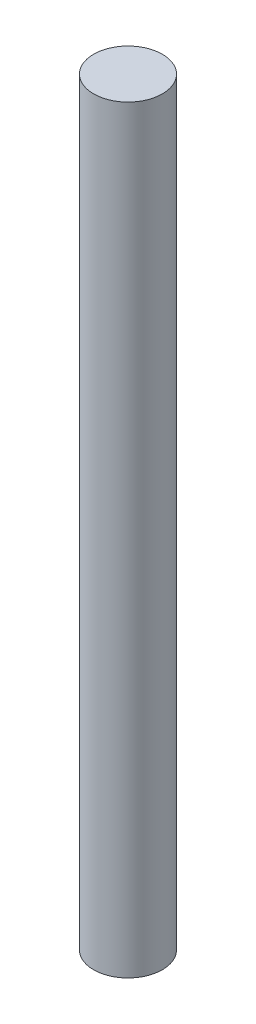
ISO-10303-21;
HEADER;
FILE_DESCRIPTION(('STEP AP214'),'2;1');
FILE_NAME('part.step','',(''),(''),'','','');
FILE_SCHEMA(('AUTOMOTIVE_DESIGN { 1 0 10303 214 1 1 1 1 }'));
ENDSEC;
DATA;
#1=APPLICATION_CONTEXT('core data for automotive mechanical design processes');
#2=APPLICATION_PROTOCOL_DEFINITION('international standard','automotive_design',2000,#1);
#3=PRODUCT_CONTEXT('',#1,'mechanical');
#4=PRODUCT('Part','Part','',(#3));
#5=PRODUCT_RELATED_PRODUCT_CATEGORY('part','',(#4));
#6=PRODUCT_DEFINITION_FORMATION('','',#4);
#7=PRODUCT_DEFINITION_CONTEXT('part definition',#1,'design');
#8=PRODUCT_DEFINITION('design','',#6,#7);
#9=PRODUCT_DEFINITION_SHAPE('','',#8);
#10=(LENGTH_UNIT() NAMED_UNIT(*) SI_UNIT(.MILLI.,.METRE.));
#11=(NAMED_UNIT(*) PLANE_ANGLE_UNIT() SI_UNIT($,.RADIAN.));
#12=(NAMED_UNIT(*) SI_UNIT($,.STERADIAN.) SOLID_ANGLE_UNIT());
#13=UNCERTAINTY_MEASURE_WITH_UNIT(LENGTH_MEASURE(1.E-05),#10,'distance_accuracy_value','');
#14=(GEOMETRIC_REPRESENTATION_CONTEXT(3) GLOBAL_UNCERTAINTY_ASSIGNED_CONTEXT((#13)) GLOBAL_UNIT_ASSIGNED_CONTEXT((#10,
#11,#12)) REPRESENTATION_CONTEXT('',''));
#15=CARTESIAN_POINT('',(0.,0.,0.));
#16=DIRECTION('',(0.,0.,1.));
#17=DIRECTION('',(1.,0.,0.));
#18=AXIS2_PLACEMENT_3D('',#15,#16,#17);
#19=CARTESIAN_POINT('',(0.,143.002,0.));
#20=DIRECTION('',(0.,-1.,0.));
#21=DIRECTION('',(0.,0.,-1.));
#22=AXIS2_PLACEMENT_3D('',#19,#20,#21);
#23=CYLINDRICAL_SURFACE('',#22,6.477);
#24=CARTESIAN_POINT('',(0.,143.002,0.));
#25=DIRECTION('',(0.,1.,0.));
#26=DIRECTION('',(0.,0.,1.));
#27=AXIS2_PLACEMENT_3D('',#24,#25,#26);
#28=CIRCLE('',#27,6.477);
#29=CARTESIAN_POINT('',(0.,143.002,6.477));
#30=VERTEX_POINT('',#29);
#31=EDGE_CURVE('E10',#30,#30,#28,.T.);
#32=ORIENTED_EDGE('',*,*,#31,.F.);
#33=EDGE_LOOP('',(#32));
#34=FACE_BOUND('',#33,.T.);
#35=CARTESIAN_POINT('',(0.,0.,0.));
#36=DIRECTION('',(0.,1.,0.));
#37=DIRECTION('',(0.,0.,1.));
#38=AXIS2_PLACEMENT_3D('',#35,#36,#37);
#39=CIRCLE('',#38,6.477);
#40=CARTESIAN_POINT('',(0.,0.,6.477));
#41=VERTEX_POINT('',#40);
#42=EDGE_CURVE('E34',#41,#41,#39,.T.);
#43=ORIENTED_EDGE('',*,*,#42,.T.);
#44=EDGE_LOOP('',(#43));
#45=FACE_BOUND('',#44,.T.);
#46=ADVANCED_FACE('F31',(#34,#45),#23,.T.);
#47=CARTESIAN_POINT('',(0.,143.002,0.));
#48=DIRECTION('',(0.,1.,0.));
#49=DIRECTION('',(0.,0.,1.));
#50=AXIS2_PLACEMENT_3D('',#47,#48,#49);
#51=PLANE('',#50);
#52=ORIENTED_EDGE('',*,*,#31,.T.);
#53=EDGE_LOOP('',(#52));
#54=FACE_BOUND('',#53,.T.);
#55=ADVANCED_FACE('F46',(#54),#51,.T.);
#56=CARTESIAN_POINT('',(0.,0.,0.));
#57=DIRECTION('',(0.,1.,0.));
#58=DIRECTION('',(0.,0.,1.));
#59=AXIS2_PLACEMENT_3D('',#56,#57,#58);
#60=PLANE('',#59);
#61=ORIENTED_EDGE('',*,*,#42,.F.);
#62=EDGE_LOOP('',(#61));
#63=FACE_BOUND('',#62,.T.);
#64=ADVANCED_FACE('F44',(#63),#60,.F.);
#65=CLOSED_SHELL('',(#46,#55,#64));
#66=MANIFOLD_SOLID_BREP('B2',#65);
#67=ADVANCED_BREP_SHAPE_REPRESENTATION('',(#18,#66),#14);
#68=SHAPE_DEFINITION_REPRESENTATION(#9,#67);
ENDSEC;
END-ISO-10303-21;
